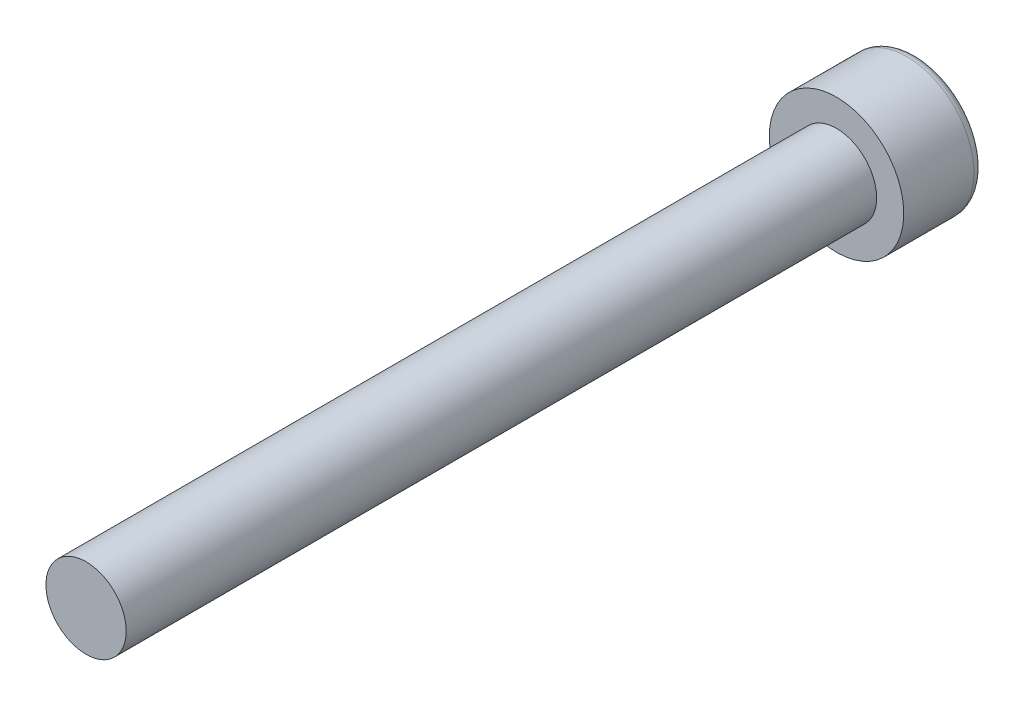
ISO-10303-21;
HEADER;
FILE_DESCRIPTION(('STEP AP214'),'2;1');
FILE_NAME('part.step','',(''),(''),'','','');
FILE_SCHEMA(('AUTOMOTIVE_DESIGN { 1 0 10303 214 1 1 1 1 }'));
ENDSEC;
DATA;
#1=APPLICATION_CONTEXT('core data for automotive mechanical design processes');
#2=APPLICATION_PROTOCOL_DEFINITION('international standard','automotive_design',2000,#1);
#3=PRODUCT_CONTEXT('',#1,'mechanical');
#4=PRODUCT('Part','Part','',(#3));
#5=PRODUCT_RELATED_PRODUCT_CATEGORY('part','',(#4));
#6=PRODUCT_DEFINITION_FORMATION('','',#4);
#7=PRODUCT_DEFINITION_CONTEXT('part definition',#1,'design');
#8=PRODUCT_DEFINITION('design','',#6,#7);
#9=PRODUCT_DEFINITION_SHAPE('','',#8);
#10=(LENGTH_UNIT() NAMED_UNIT(*) SI_UNIT(.MILLI.,.METRE.));
#11=(NAMED_UNIT(*) PLANE_ANGLE_UNIT() SI_UNIT($,.RADIAN.));
#12=(NAMED_UNIT(*) SI_UNIT($,.STERADIAN.) SOLID_ANGLE_UNIT());
#13=UNCERTAINTY_MEASURE_WITH_UNIT(LENGTH_MEASURE(1.E-05),#10,'distance_accuracy_value','');
#14=(GEOMETRIC_REPRESENTATION_CONTEXT(3) GLOBAL_UNCERTAINTY_ASSIGNED_CONTEXT((#13)) GLOBAL_UNIT_ASSIGNED_CONTEXT((#10,
#11,#12)) REPRESENTATION_CONTEXT('',''));
#15=CARTESIAN_POINT('',(0.,0.,0.));
#16=DIRECTION('',(0.,0.,1.));
#17=DIRECTION('',(1.,0.,0.));
#18=AXIS2_PLACEMENT_3D('',#15,#16,#17);
#19=CARTESIAN_POINT('',(0.,0.,37.4));
#20=DIRECTION('',(0.,0.,-1.));
#21=DIRECTION('',(-1.,0.,0.));
#22=AXIS2_PLACEMENT_3D('',#19,#20,#21);
#23=CYLINDRICAL_SURFACE('',#22,2.);
#24=CARTESIAN_POINT('',(0.,0.,37.4));
#25=DIRECTION('',(0.,0.,1.));
#26=DIRECTION('',(1.,0.,0.));
#27=AXIS2_PLACEMENT_3D('',#24,#25,#26);
#28=CIRCLE('',#27,2.);
#29=CARTESIAN_POINT('',(2.,0.,37.4));
#30=VERTEX_POINT('',#29);
#31=EDGE_CURVE('E168',#30,#30,#28,.T.);
#32=ORIENTED_EDGE('',*,*,#31,.F.);
#33=EDGE_LOOP('',(#32));
#34=FACE_BOUND('',#33,.T.);
#35=CARTESIAN_POINT('',(0.,0.,0.));
#36=DIRECTION('',(0.,0.,1.));
#37=DIRECTION('',(1.,0.,0.));
#38=AXIS2_PLACEMENT_3D('',#35,#36,#37);
#39=CIRCLE('',#38,2.);
#40=CARTESIAN_POINT('',(2.,0.,0.));
#41=VERTEX_POINT('',#40);
#42=EDGE_CURVE('E167',#41,#41,#39,.T.);
#43=ORIENTED_EDGE('',*,*,#42,.T.);
#44=EDGE_LOOP('',(#43));
#45=FACE_BOUND('',#44,.T.);
#46=ADVANCED_FACE('F39',(#34,#45),#23,.T.);
#47=CARTESIAN_POINT('',(0.,0.,37.4));
#48=DIRECTION('',(0.,0.,1.));
#49=DIRECTION('',(1.,0.,0.));
#50=AXIS2_PLACEMENT_3D('',#47,#48,#49);
#51=PLANE('',#50);
#52=ORIENTED_EDGE('',*,*,#31,.T.);
#53=EDGE_LOOP('',(#52));
#54=FACE_BOUND('',#53,.T.);
#55=ADVANCED_FACE('F190',(#54),#51,.T.);
#56=CARTESIAN_POINT('',(0.,0.,-4.));
#57=DIRECTION('',(0.,0.,1.));
#58=DIRECTION('',(1.,0.,0.));
#59=AXIS2_PLACEMENT_3D('',#56,#57,#58);
#60=CYLINDRICAL_SURFACE('',#59,3.35);
#61=CARTESIAN_POINT('',(0.,0.,-3.5));
#62=DIRECTION('',(0.,0.,-1.));
#63=DIRECTION('',(-1.,0.,0.));
#64=AXIS2_PLACEMENT_3D('',#61,#62,#63);
#65=CIRCLE('',#64,3.35);
#66=CARTESIAN_POINT('',(-3.35,0.,-3.5));
#67=VERTEX_POINT('',#66);
#68=EDGE_CURVE('E11',#67,#67,#65,.F.);
#69=ORIENTED_EDGE('',*,*,#68,.T.);
#70=EDGE_LOOP('',(#69));
#71=FACE_BOUND('',#70,.T.);
#72=CARTESIAN_POINT('',(0.,0.,0.));
#73=DIRECTION('',(0.,0.,-1.));
#74=DIRECTION('',(-1.,0.,0.));
#75=AXIS2_PLACEMENT_3D('',#72,#73,#74);
#76=CIRCLE('',#75,3.35);
#77=CARTESIAN_POINT('',(-3.35,0.,0.));
#78=VERTEX_POINT('',#77);
#79=EDGE_CURVE('E154',#78,#78,#76,.T.);
#80=ORIENTED_EDGE('',*,*,#79,.T.);
#81=EDGE_LOOP('',(#80));
#82=FACE_BOUND('',#81,.T.);
#83=ADVANCED_FACE('F195',(#71,#82),#60,.T.);
#84=CARTESIAN_POINT('',(0.,0.,-4.));
#85=DIRECTION('',(0.,0.,-1.));
#86=DIRECTION('',(-1.,0.,0.));
#87=AXIS2_PLACEMENT_3D('',#84,#85,#86);
#88=PLANE('',#87);
#89=CARTESIAN_POINT('',(0.,0.,-4.));
#90=DIRECTION('',(0.,0.,-1.));
#91=DIRECTION('',(-1.,0.,0.));
#92=AXIS2_PLACEMENT_3D('',#89,#90,#91);
#93=CIRCLE('',#92,2.85);
#94=CARTESIAN_POINT('',(-2.85,0.,-4.));
#95=VERTEX_POINT('',#94);
#96=EDGE_CURVE('E48',#95,#95,#93,.T.);
#97=ORIENTED_EDGE('',*,*,#96,.T.);
#98=EDGE_LOOP('',(#97));
#99=FACE_BOUND('',#98,.T.);
#100=DIRECTION('',(-0.866025403784439,-0.5,0.));
#101=VECTOR('',#100,1.);
#102=CARTESIAN_POINT('',(1.60214699700121,-0.925,-4.));
#103=LINE('',#102,#101);
#104=CARTESIAN_POINT('',(1.60214699700121,-0.925,-4.));
#105=VERTEX_POINT('',#104);
#106=CARTESIAN_POINT('',(0.,-1.85,-4.));
#107=VERTEX_POINT('',#106);
#108=EDGE_CURVE('E55',#105,#107,#103,.T.);
#109=ORIENTED_EDGE('',*,*,#108,.F.);
#110=DIRECTION('',(0.,-1.,0.));
#111=VECTOR('',#110,1.);
#112=CARTESIAN_POINT('',(1.60214699700121,0.925,-4.));
#113=LINE('',#112,#111);
#114=CARTESIAN_POINT('',(1.60214699700121,0.925,-4.));
#115=VERTEX_POINT('',#114);
#116=EDGE_CURVE('E148',#115,#105,#113,.T.);
#117=ORIENTED_EDGE('',*,*,#116,.F.);
#118=DIRECTION('',(0.866025403784439,-0.5,0.));
#119=VECTOR('',#118,1.);
#120=CARTESIAN_POINT('',(0.,1.85,-4.));
#121=LINE('',#120,#119);
#122=CARTESIAN_POINT('',(0.,1.85,-4.));
#123=VERTEX_POINT('',#122);
#124=EDGE_CURVE('E145',#123,#115,#121,.T.);
#125=ORIENTED_EDGE('',*,*,#124,.F.);
#126=DIRECTION('',(0.866025403784439,0.5,0.));
#127=VECTOR('',#126,1.);
#128=CARTESIAN_POINT('',(-1.60214699700121,0.925000000000001,-4.));
#129=LINE('',#128,#127);
#130=CARTESIAN_POINT('',(-1.60214699700121,0.925000000000001,-4.));
#131=VERTEX_POINT('',#130);
#132=EDGE_CURVE('E103',#131,#123,#129,.T.);
#133=ORIENTED_EDGE('',*,*,#132,.F.);
#134=DIRECTION('',(0.,1.,0.));
#135=VECTOR('',#134,1.);
#136=CARTESIAN_POINT('',(-1.60214699700121,-0.925,-4.));
#137=LINE('',#136,#135);
#138=CARTESIAN_POINT('',(-1.60214699700121,-0.925,-4.));
#139=VERTEX_POINT('',#138);
#140=EDGE_CURVE('E139',#139,#131,#137,.T.);
#141=ORIENTED_EDGE('',*,*,#140,.F.);
#142=DIRECTION('',(-0.866025403784439,0.5,0.));
#143=VECTOR('',#142,1.);
#144=CARTESIAN_POINT('',(0.,-1.85,-4.));
#145=LINE('',#144,#143);
#146=EDGE_CURVE('E135',#107,#139,#145,.T.);
#147=ORIENTED_EDGE('',*,*,#146,.F.);
#148=EDGE_LOOP('',(#109,#117,#125,#133,#141,#147));
#149=FACE_BOUND('',#148,.T.);
#150=ADVANCED_FACE('F178',(#99,#149),#88,.T.);
#151=CARTESIAN_POINT('',(0.,0.,0.));
#152=DIRECTION('',(0.,0.,-1.));
#153=DIRECTION('',(-1.,0.,0.));
#154=AXIS2_PLACEMENT_3D('',#151,#152,#153);
#155=PLANE('',#154);
#156=ORIENTED_EDGE('',*,*,#42,.F.);
#157=EDGE_LOOP('',(#156));
#158=FACE_BOUND('',#157,.T.);
#159=ORIENTED_EDGE('',*,*,#79,.F.);
#160=EDGE_LOOP('',(#159));
#161=FACE_BOUND('',#160,.T.);
#162=ADVANCED_FACE('F204',(#158,#161),#155,.F.);
#163=CARTESIAN_POINT('',(1.60214699700121,-0.925,-1.5));
#164=DIRECTION('',(0.5,-0.866025403784439,0.));
#165=DIRECTION('',(0.866025403784439,0.5,0.));
#166=AXIS2_PLACEMENT_3D('',#163,#164,#165);
#167=PLANE('',#166);
#168=ORIENTED_EDGE('',*,*,#108,.T.);
#169=DIRECTION('',(0.,0.,-1.));
#170=VECTOR('',#169,1.);
#171=CARTESIAN_POINT('',(0.,-1.85,-1.5));
#172=LINE('',#171,#170);
#173=CARTESIAN_POINT('',(0.,-1.85,-1.5));
#174=VERTEX_POINT('',#173);
#175=EDGE_CURVE('E85',#174,#107,#172,.T.);
#176=ORIENTED_EDGE('',*,*,#175,.F.);
#177=DIRECTION('',(-0.866025403784439,-0.5,0.));
#178=VECTOR('',#177,1.);
#179=CARTESIAN_POINT('',(1.60214699700121,-0.925,-1.5));
#180=LINE('',#179,#178);
#181=CARTESIAN_POINT('',(1.60214699700121,-0.925,-1.5));
#182=VERTEX_POINT('',#181);
#183=EDGE_CURVE('E151',#182,#174,#180,.T.);
#184=ORIENTED_EDGE('',*,*,#183,.F.);
#185=DIRECTION('',(0.,0.,-1.));
#186=VECTOR('',#185,1.);
#187=CARTESIAN_POINT('',(1.60214699700121,-0.925,-1.5));
#188=LINE('',#187,#186);
#189=EDGE_CURVE('E63',#182,#105,#188,.T.);
#190=ORIENTED_EDGE('',*,*,#189,.T.);
#191=EDGE_LOOP('',(#168,#176,#184,#190));
#192=FACE_BOUND('',#191,.T.);
#193=ADVANCED_FACE('F207',(#192),#167,.F.);
#194=CARTESIAN_POINT('',(1.60214699700121,0.925,-1.5));
#195=DIRECTION('',(1.,0.,0.));
#196=DIRECTION('',(0.,0.,-1.));
#197=AXIS2_PLACEMENT_3D('',#194,#195,#196);
#198=PLANE('',#197);
#199=ORIENTED_EDGE('',*,*,#116,.T.);
#200=ORIENTED_EDGE('',*,*,#189,.F.);
#201=DIRECTION('',(0.,-1.,0.));
#202=VECTOR('',#201,1.);
#203=CARTESIAN_POINT('',(1.60214699700121,0.925,-1.5));
#204=LINE('',#203,#202);
#205=CARTESIAN_POINT('',(1.60214699700121,0.925,-1.5));
#206=VERTEX_POINT('',#205);
#207=EDGE_CURVE('E117',#206,#182,#204,.T.);
#208=ORIENTED_EDGE('',*,*,#207,.F.);
#209=DIRECTION('',(0.,0.,-1.));
#210=VECTOR('',#209,1.);
#211=CARTESIAN_POINT('',(1.60214699700121,0.925,-1.5));
#212=LINE('',#211,#210);
#213=EDGE_CURVE('E108',#206,#115,#212,.T.);
#214=ORIENTED_EDGE('',*,*,#213,.T.);
#215=EDGE_LOOP('',(#199,#200,#208,#214));
#216=FACE_BOUND('',#215,.T.);
#217=ADVANCED_FACE('F213',(#216),#198,.F.);
#218=CARTESIAN_POINT('',(0.,1.85,-1.5));
#219=DIRECTION('',(0.5,0.866025403784439,0.));
#220=DIRECTION('',(-0.866025403784439,0.5,0.));
#221=AXIS2_PLACEMENT_3D('',#218,#219,#220);
#222=PLANE('',#221);
#223=ORIENTED_EDGE('',*,*,#124,.T.);
#224=ORIENTED_EDGE('',*,*,#213,.F.);
#225=DIRECTION('',(0.866025403784439,-0.5,0.));
#226=VECTOR('',#225,1.);
#227=CARTESIAN_POINT('',(0.,1.85,-1.5));
#228=LINE('',#227,#226);
#229=CARTESIAN_POINT('',(0.,1.85,-1.5));
#230=VERTEX_POINT('',#229);
#231=EDGE_CURVE('E112',#230,#206,#228,.T.);
#232=ORIENTED_EDGE('',*,*,#231,.F.);
#233=DIRECTION('',(0.,0.,-1.));
#234=VECTOR('',#233,1.);
#235=CARTESIAN_POINT('',(0.,1.85,-1.5));
#236=LINE('',#235,#234);
#237=EDGE_CURVE('E96',#230,#123,#236,.T.);
#238=ORIENTED_EDGE('',*,*,#237,.T.);
#239=EDGE_LOOP('',(#223,#224,#232,#238));
#240=FACE_BOUND('',#239,.T.);
#241=ADVANCED_FACE('F113',(#240),#222,.F.);
#242=CARTESIAN_POINT('',(-1.60214699700121,0.925000000000001,-1.5));
#243=DIRECTION('',(-0.5,0.866025403784439,0.));
#244=DIRECTION('',(-0.866025403784439,-0.5,0.));
#245=AXIS2_PLACEMENT_3D('',#242,#243,#244);
#246=PLANE('',#245);
#247=ORIENTED_EDGE('',*,*,#132,.T.);
#248=ORIENTED_EDGE('',*,*,#237,.F.);
#249=DIRECTION('',(0.866025403784439,0.5,0.));
#250=VECTOR('',#249,1.);
#251=CARTESIAN_POINT('',(-1.60214699700121,0.925000000000001,-1.5));
#252=LINE('',#251,#250);
#253=CARTESIAN_POINT('',(-1.60214699700121,0.925000000000001,-1.5));
#254=VERTEX_POINT('',#253);
#255=EDGE_CURVE('E100',#254,#230,#252,.T.);
#256=ORIENTED_EDGE('',*,*,#255,.F.);
#257=DIRECTION('',(0.,0.,-1.));
#258=VECTOR('',#257,1.);
#259=CARTESIAN_POINT('',(-1.60214699700121,0.925000000000001,-1.5));
#260=LINE('',#259,#258);
#261=EDGE_CURVE('E109',#254,#131,#260,.T.);
#262=ORIENTED_EDGE('',*,*,#261,.T.);
#263=EDGE_LOOP('',(#247,#248,#256,#262));
#264=FACE_BOUND('',#263,.T.);
#265=ADVANCED_FACE('F98',(#264),#246,.F.);
#266=CARTESIAN_POINT('',(-1.60214699700121,-0.925,-1.5));
#267=DIRECTION('',(-1.,0.,0.));
#268=DIRECTION('',(0.,-1.,0.));
#269=AXIS2_PLACEMENT_3D('',#266,#267,#268);
#270=PLANE('',#269);
#271=ORIENTED_EDGE('',*,*,#140,.T.);
#272=ORIENTED_EDGE('',*,*,#261,.F.);
#273=DIRECTION('',(0.,1.,0.));
#274=VECTOR('',#273,1.);
#275=CARTESIAN_POINT('',(-1.60214699700121,-0.925,-1.5));
#276=LINE('',#275,#274);
#277=CARTESIAN_POINT('',(-1.60214699700121,-0.925,-1.5));
#278=VERTEX_POINT('',#277);
#279=EDGE_CURVE('E123',#278,#254,#276,.T.);
#280=ORIENTED_EDGE('',*,*,#279,.F.);
#281=DIRECTION('',(0.,0.,-1.));
#282=VECTOR('',#281,1.);
#283=CARTESIAN_POINT('',(-1.60214699700121,-0.925,-1.5));
#284=LINE('',#283,#282);
#285=EDGE_CURVE('E159',#278,#139,#284,.T.);
#286=ORIENTED_EDGE('',*,*,#285,.T.);
#287=EDGE_LOOP('',(#271,#272,#280,#286));
#288=FACE_BOUND('',#287,.T.);
#289=ADVANCED_FACE('F216',(#288),#270,.F.);
#290=CARTESIAN_POINT('',(0.,-1.85,-1.5));
#291=DIRECTION('',(-0.5,-0.866025403784439,0.));
#292=DIRECTION('',(0.866025403784439,-0.5,0.));
#293=AXIS2_PLACEMENT_3D('',#290,#291,#292);
#294=PLANE('',#293);
#295=ORIENTED_EDGE('',*,*,#146,.T.);
#296=ORIENTED_EDGE('',*,*,#285,.F.);
#297=DIRECTION('',(-0.866025403784439,0.5,0.));
#298=VECTOR('',#297,1.);
#299=CARTESIAN_POINT('',(0.,-1.85,-1.5));
#300=LINE('',#299,#298);
#301=EDGE_CURVE('E127',#174,#278,#300,.T.);
#302=ORIENTED_EDGE('',*,*,#301,.F.);
#303=ORIENTED_EDGE('',*,*,#175,.T.);
#304=EDGE_LOOP('',(#295,#296,#302,#303));
#305=FACE_BOUND('',#304,.T.);
#306=ADVANCED_FACE('F186',(#305),#294,.F.);
#307=CARTESIAN_POINT('',(0.,0.,-1.5));
#308=DIRECTION('',(0.,0.,-1.));
#309=DIRECTION('',(-1.,0.,0.));
#310=AXIS2_PLACEMENT_3D('',#307,#308,#309);
#311=PLANE('',#310);
#312=ORIENTED_EDGE('',*,*,#183,.T.);
#313=ORIENTED_EDGE('',*,*,#301,.T.);
#314=ORIENTED_EDGE('',*,*,#279,.T.);
#315=ORIENTED_EDGE('',*,*,#255,.T.);
#316=ORIENTED_EDGE('',*,*,#231,.T.);
#317=ORIENTED_EDGE('',*,*,#207,.T.);
#318=EDGE_LOOP('',(#312,#313,#314,#315,#316,#317));
#319=FACE_BOUND('',#318,.T.);
#320=ADVANCED_FACE('F120',(#319),#311,.T.);
#321=CARTESIAN_POINT('',(0.,0.,-3.5));
#322=DIRECTION('',(0.,0.,-1.));
#323=DIRECTION('',(-1.,0.,0.));
#324=AXIS2_PLACEMENT_3D('',#321,#322,#323);
#325=TOROIDAL_SURFACE('',#324,2.85,0.5);
#326=ORIENTED_EDGE('',*,*,#68,.F.);
#327=EDGE_LOOP('',(#326));
#328=FACE_BOUND('',#327,.T.);
#329=ORIENTED_EDGE('',*,*,#96,.F.);
#330=EDGE_LOOP('',(#329));
#331=FACE_BOUND('',#330,.T.);
#332=ADVANCED_FACE('F41',(#328,#331),#325,.T.);
#333=CLOSED_SHELL('',(#46,#55,#83,#150,#162,#193,#217,#241,#265,#289,#306,#320,#332));
#334=MANIFOLD_SOLID_BREP('B2',#333);
#335=ADVANCED_BREP_SHAPE_REPRESENTATION('',(#18,#334),#14);
#336=SHAPE_DEFINITION_REPRESENTATION(#9,#335);
ENDSEC;
END-ISO-10303-21;
